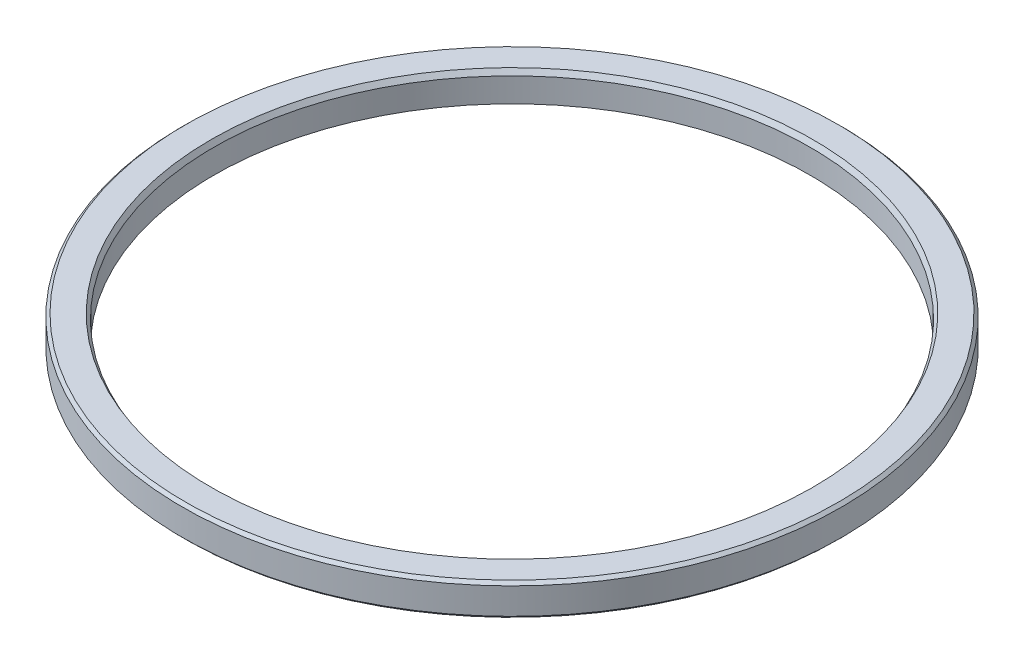
ISO-10303-21;
HEADER;
FILE_DESCRIPTION(('STEP AP214'),'2;1');
FILE_NAME('part.step','',(''),(''),'','','');
FILE_SCHEMA(('AUTOMOTIVE_DESIGN { 1 0 10303 214 1 1 1 1 }'));
ENDSEC;
DATA;
#1=APPLICATION_CONTEXT('core data for automotive mechanical design processes');
#2=APPLICATION_PROTOCOL_DEFINITION('international standard','automotive_design',2000,#1);
#3=PRODUCT_CONTEXT('',#1,'mechanical');
#4=PRODUCT('Part','Part','',(#3));
#5=PRODUCT_RELATED_PRODUCT_CATEGORY('part','',(#4));
#6=PRODUCT_DEFINITION_FORMATION('','',#4);
#7=PRODUCT_DEFINITION_CONTEXT('part definition',#1,'design');
#8=PRODUCT_DEFINITION('design','',#6,#7);
#9=PRODUCT_DEFINITION_SHAPE('','',#8);
#10=(LENGTH_UNIT() NAMED_UNIT(*) SI_UNIT(.MILLI.,.METRE.));
#11=(NAMED_UNIT(*) PLANE_ANGLE_UNIT() SI_UNIT($,.RADIAN.));
#12=(NAMED_UNIT(*) SI_UNIT($,.STERADIAN.) SOLID_ANGLE_UNIT());
#13=UNCERTAINTY_MEASURE_WITH_UNIT(LENGTH_MEASURE(1.E-05),#10,'distance_accuracy_value','');
#14=(GEOMETRIC_REPRESENTATION_CONTEXT(3) GLOBAL_UNCERTAINTY_ASSIGNED_CONTEXT((#13)) GLOBAL_UNIT_ASSIGNED_CONTEXT((#10,
#11,#12)) REPRESENTATION_CONTEXT('',''));
#15=CARTESIAN_POINT('',(0.,0.,0.));
#16=DIRECTION('',(0.,0.,1.));
#17=DIRECTION('',(1.,0.,0.));
#18=AXIS2_PLACEMENT_3D('',#15,#16,#17);
#19=CARTESIAN_POINT('',(0.,0.578947349924638,0.));
#20=DIRECTION('',(0.,1.,0.));
#21=DIRECTION('',(0.941551837108085,0.,-0.336868131526849));
#22=AXIS2_PLACEMENT_3D('',#19,#20,#21);
#23=PLANE('',#22);
#24=CARTESIAN_POINT('',(0.,0.578947349924638,0.));
#25=DIRECTION('',(0.,1.,0.));
#26=DIRECTION('',(0.941551837108085,0.,-0.336868131526849));
#27=AXIS2_PLACEMENT_3D('',#24,#25,#26);
#28=CIRCLE('',#27,28.321);
#29=CARTESIAN_POINT('',(26.6656895787381,0.578947349924638,-9.5404423529719));
#30=VERTEX_POINT('',#29);
#31=EDGE_CURVE('E10',#30,#30,#28,.T.);
#32=ORIENTED_EDGE('',*,*,#31,.T.);
#33=EDGE_LOOP('',(#32));
#34=FACE_BOUND('',#33,.T.);
#35=CARTESIAN_POINT('',(0.,0.578947349924638,0.));
#36=DIRECTION('',(0.,1.,0.));
#37=DIRECTION('',(0.941551837108085,0.,-0.336868131526849));
#38=AXIS2_PLACEMENT_3D('',#35,#36,#37);
#39=CIRCLE('',#38,26.0985);
#40=CARTESIAN_POINT('',(24.5730906207654,0.578947349924638,-8.79175293065348));
#41=VERTEX_POINT('',#40);
#42=EDGE_CURVE('E40',#41,#41,#39,.F.);
#43=ORIENTED_EDGE('',*,*,#42,.T.);
#44=EDGE_LOOP('',(#43));
#45=FACE_BOUND('',#44,.T.);
#46=ADVANCED_FACE('F15',(#34,#45),#23,.T.);
#47=CARTESIAN_POINT('',(0.,-2.21505265007536,0.));
#48=DIRECTION('',(0.,1.,0.));
#49=DIRECTION('',(0.941551837108085,0.,-0.336868131526849));
#50=AXIS2_PLACEMENT_3D('',#47,#48,#49);
#51=PLANE('',#50);
#52=CARTESIAN_POINT('',(0.,-2.21505265007536,0.));
#53=DIRECTION('',(0.,1.,0.));
#54=DIRECTION('',(0.941551837108085,0.,-0.336868131526849));
#55=AXIS2_PLACEMENT_3D('',#52,#53,#54);
#56=CIRCLE('',#55,28.321);
#57=CARTESIAN_POINT('',(26.6656895787381,-2.21505265007536,-9.5404423529719));
#58=VERTEX_POINT('',#57);
#59=EDGE_CURVE('E23',#58,#58,#56,.F.);
#60=ORIENTED_EDGE('',*,*,#59,.T.);
#61=EDGE_LOOP('',(#60));
#62=FACE_BOUND('',#61,.T.);
#63=CARTESIAN_POINT('',(0.,-2.21505265007536,0.));
#64=DIRECTION('',(0.,1.,0.));
#65=DIRECTION('',(0.941551837108085,0.,-0.336868131526849));
#66=AXIS2_PLACEMENT_3D('',#63,#64,#65);
#67=CIRCLE('',#66,26.2844409051225);
#68=CARTESIAN_POINT('',(24.748163621577,-2.21505265007536,-8.8543904959365));
#69=VERTEX_POINT('',#68);
#70=EDGE_CURVE('E52',#69,#69,#67,.T.);
#71=ORIENTED_EDGE('',*,*,#70,.T.);
#72=EDGE_LOOP('',(#71));
#73=FACE_BOUND('',#72,.T.);
#74=ADVANCED_FACE('F57',(#62,#73),#51,.F.);
#75=CARTESIAN_POINT('',(0.,0.578947349924638,0.));
#76=DIRECTION('',(0.,-1.,0.));
#77=DIRECTION('',(-0.941551837108085,0.,0.336868131526849));
#78=AXIS2_PLACEMENT_3D('',#75,#76,#77);
#79=CYLINDRICAL_SURFACE('',#78,28.575);
#80=CARTESIAN_POINT('',(0.,-1.96105265007538,0.));
#81=DIRECTION('',(0.,1.,0.));
#82=DIRECTION('',(0.941551837108085,0.,-0.336868131526849));
#83=AXIS2_PLACEMENT_3D('',#80,#81,#82);
#84=CIRCLE('',#83,28.575);
#85=CARTESIAN_POINT('',(26.9048437453635,-1.96105265007538,-9.62600685837971));
#86=VERTEX_POINT('',#85);
#87=EDGE_CURVE('E30',#86,#86,#84,.T.);
#88=ORIENTED_EDGE('',*,*,#87,.T.);
#89=EDGE_LOOP('',(#88));
#90=FACE_BOUND('',#89,.T.);
#91=CARTESIAN_POINT('',(0.,0.324947349924651,0.));
#92=DIRECTION('',(0.,1.,0.));
#93=DIRECTION('',(0.941551837108085,0.,-0.336868131526849));
#94=AXIS2_PLACEMENT_3D('',#91,#92,#93);
#95=CIRCLE('',#94,28.575);
#96=CARTESIAN_POINT('',(26.9048437453635,0.324947349924651,-9.62600685837971));
#97=VERTEX_POINT('',#96);
#98=EDGE_CURVE('E35',#97,#97,#95,.F.);
#99=ORIENTED_EDGE('',*,*,#98,.T.);
#100=EDGE_LOOP('',(#99));
#101=FACE_BOUND('',#100,.T.);
#102=ADVANCED_FACE('F73',(#90,#101),#79,.T.);
#103=CARTESIAN_POINT('',(0.,0.578947349924638,0.));
#104=DIRECTION('',(0.,-1.,0.));
#105=DIRECTION('',(-0.941551837108085,0.,0.336868131526849));
#106=AXIS2_PLACEMENT_3D('',#103,#104,#105);
#107=CYLINDRICAL_SURFACE('',#106,25.8445);
#108=CARTESIAN_POINT('',(0.,-1.96105265007537,0.));
#109=DIRECTION('',(0.,1.,0.));
#110=DIRECTION('',(0.941551837108085,0.,-0.336868131526849));
#111=AXIS2_PLACEMENT_3D('',#108,#109,#110);
#112=CIRCLE('',#111,25.8445);
#113=CARTESIAN_POINT('',(24.3339364541399,-1.96105265007537,-8.70618842524565));
#114=VERTEX_POINT('',#113);
#115=EDGE_CURVE('E44',#114,#114,#112,.F.);
#116=ORIENTED_EDGE('',*,*,#115,.T.);
#117=EDGE_LOOP('',(#116));
#118=FACE_BOUND('',#117,.T.);
#119=CARTESIAN_POINT('',(0.,0.139006444802085,0.));
#120=DIRECTION('',(0.,1.,0.));
#121=DIRECTION('',(0.941551837108085,0.,-0.336868131526849));
#122=AXIS2_PLACEMENT_3D('',#119,#120,#121);
#123=CIRCLE('',#122,25.8445);
#124=CARTESIAN_POINT('',(24.3339364541399,0.139006444802085,-8.70618842524565));
#125=VERTEX_POINT('',#124);
#126=EDGE_CURVE('E48',#125,#125,#123,.T.);
#127=ORIENTED_EDGE('',*,*,#126,.T.);
#128=EDGE_LOOP('',(#127));
#129=FACE_BOUND('',#128,.T.);
#130=ADVANCED_FACE('F62',(#118,#129),#107,.F.);
#131=CARTESIAN_POINT('',(0.,-2.21505265007536,0.));
#132=DIRECTION('',(0.,-1.,0.));
#133=DIRECTION('',(-0.941551837108085,0.,0.336868131526849));
#134=AXIS2_PLACEMENT_3D('',#131,#132,#133);
#135=CONICAL_SURFACE('',#134,26.2844409051225,1.0471975511966);
#136=ORIENTED_EDGE('',*,*,#115,.F.);
#137=EDGE_LOOP('',(#136));
#138=FACE_BOUND('',#137,.T.);
#139=ORIENTED_EDGE('',*,*,#70,.F.);
#140=EDGE_LOOP('',(#139));
#141=FACE_BOUND('',#140,.T.);
#142=ADVANCED_FACE('F59',(#138,#141),#135,.F.);
#143=CARTESIAN_POINT('',(0.,0.139006444802085,0.));
#144=DIRECTION('',(0.,1.,0.));
#145=DIRECTION('',(0.941551837108085,0.,-0.336868131526849));
#146=AXIS2_PLACEMENT_3D('',#143,#144,#145);
#147=CONICAL_SURFACE('',#146,25.8445,0.523598775598296);
#148=ORIENTED_EDGE('',*,*,#42,.F.);
#149=EDGE_LOOP('',(#148));
#150=FACE_BOUND('',#149,.T.);
#151=ORIENTED_EDGE('',*,*,#126,.F.);
#152=EDGE_LOOP('',(#151));
#153=FACE_BOUND('',#152,.T.);
#154=ADVANCED_FACE('F61',(#150,#153),#147,.F.);
#155=CARTESIAN_POINT('',(0.,-1.96105265007538,0.));
#156=DIRECTION('',(0.,1.,0.));
#157=DIRECTION('',(0.941551837108085,0.,-0.336868131526849));
#158=AXIS2_PLACEMENT_3D('',#155,#156,#157);
#159=CONICAL_SURFACE('',#158,28.575,0.785398163397455);
#160=ORIENTED_EDGE('',*,*,#59,.F.);
#161=EDGE_LOOP('',(#160));
#162=FACE_BOUND('',#161,.T.);
#163=ORIENTED_EDGE('',*,*,#87,.F.);
#164=EDGE_LOOP('',(#163));
#165=FACE_BOUND('',#164,.T.);
#166=ADVANCED_FACE('F70',(#162,#165),#159,.T.);
#167=CARTESIAN_POINT('',(0.,0.578947349924638,0.));
#168=DIRECTION('',(0.,-1.,0.));
#169=DIRECTION('',(-0.941551837108085,0.,0.336868131526849));
#170=AXIS2_PLACEMENT_3D('',#167,#168,#169);
#171=CONICAL_SURFACE('',#170,28.321,0.785398163397462);
#172=ORIENTED_EDGE('',*,*,#98,.F.);
#173=EDGE_LOOP('',(#172));
#174=FACE_BOUND('',#173,.T.);
#175=ORIENTED_EDGE('',*,*,#31,.F.);
#176=EDGE_LOOP('',(#175));
#177=FACE_BOUND('',#176,.T.);
#178=ADVANCED_FACE('F17',(#174,#177),#171,.T.);
#179=CLOSED_SHELL('',(#46,#74,#102,#130,#142,#154,#166,#178));
#180=MANIFOLD_SOLID_BREP('B1',#179);
#181=ADVANCED_BREP_SHAPE_REPRESENTATION('',(#18,#180),#14);
#182=SHAPE_DEFINITION_REPRESENTATION(#9,#181);
ENDSEC;
END-ISO-10303-21;
